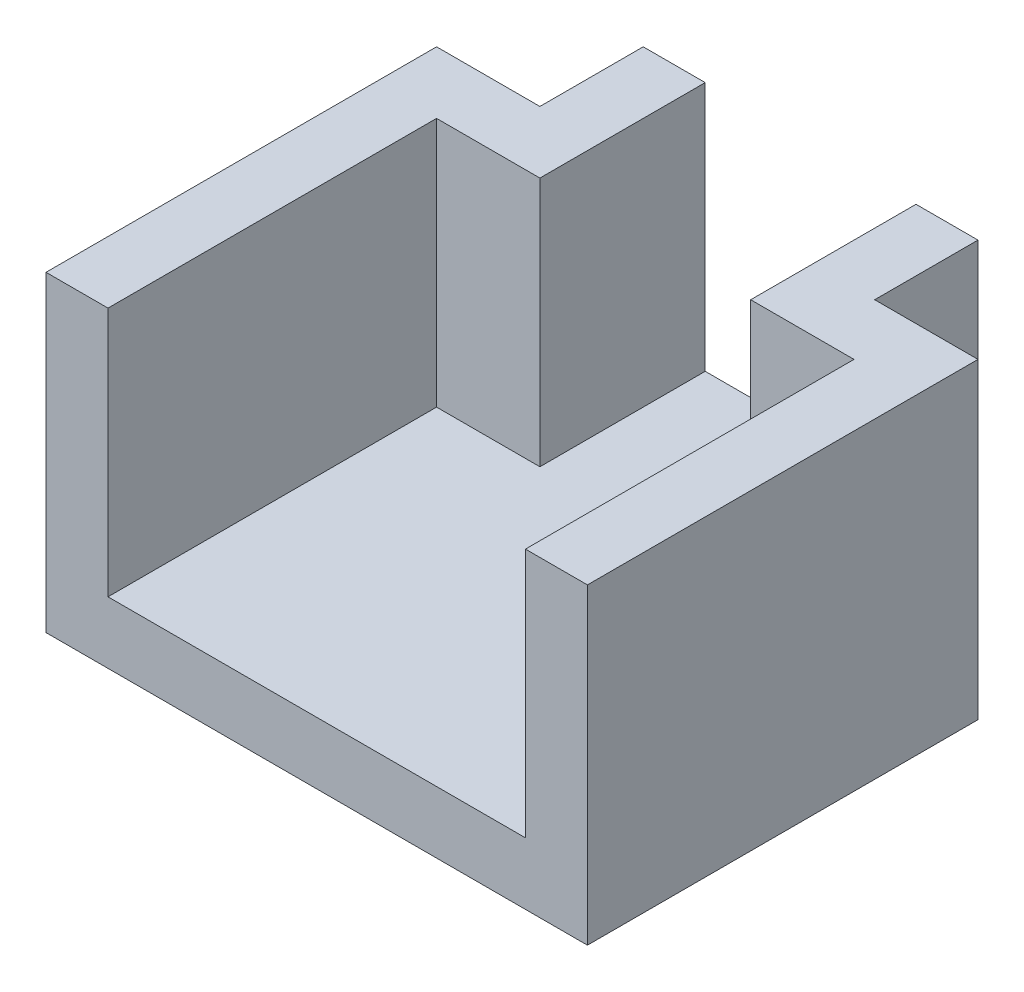
ISO-10303-21;
HEADER;
FILE_DESCRIPTION(('STEP AP214'),'2;1');
FILE_NAME('part.step','',(''),(''),'','','');
FILE_SCHEMA(('AUTOMOTIVE_DESIGN { 1 0 10303 214 1 1 1 1 }'));
ENDSEC;
DATA;
#1=APPLICATION_CONTEXT('core data for automotive mechanical design processes');
#2=APPLICATION_PROTOCOL_DEFINITION('international standard','automotive_design',2000,#1);
#3=PRODUCT_CONTEXT('',#1,'mechanical');
#4=PRODUCT('Part','Part','',(#3));
#5=PRODUCT_RELATED_PRODUCT_CATEGORY('part','',(#4));
#6=PRODUCT_DEFINITION_FORMATION('','',#4);
#7=PRODUCT_DEFINITION_CONTEXT('part definition',#1,'design');
#8=PRODUCT_DEFINITION('design','',#6,#7);
#9=PRODUCT_DEFINITION_SHAPE('','',#8);
#10=(LENGTH_UNIT() NAMED_UNIT(*) SI_UNIT(.MILLI.,.METRE.));
#11=(NAMED_UNIT(*) PLANE_ANGLE_UNIT() SI_UNIT($,.RADIAN.));
#12=(NAMED_UNIT(*) SI_UNIT($,.STERADIAN.) SOLID_ANGLE_UNIT());
#13=UNCERTAINTY_MEASURE_WITH_UNIT(LENGTH_MEASURE(1.E-05),#10,'distance_accuracy_value','');
#14=(GEOMETRIC_REPRESENTATION_CONTEXT(3) GLOBAL_UNCERTAINTY_ASSIGNED_CONTEXT((#13)) GLOBAL_UNIT_ASSIGNED_CONTEXT((#10,
#11,#12)) REPRESENTATION_CONTEXT('',''));
#15=CARTESIAN_POINT('',(0.,0.,0.));
#16=DIRECTION('',(0.,0.,1.));
#17=DIRECTION('',(1.,0.,0.));
#18=AXIS2_PLACEMENT_3D('',#15,#16,#17);
#19=CARTESIAN_POINT('',(0.,3.,0.));
#20=DIRECTION('',(0.,1.,0.));
#21=DIRECTION('',(0.,0.,1.));
#22=AXIS2_PLACEMENT_3D('',#19,#20,#21);
#23=PLANE('',#22);
#24=DIRECTION('',(-1.,0.,0.));
#25=VECTOR('',#24,1.);
#26=CARTESIAN_POINT('',(0.,3.,8.));
#27=LINE('',#26,#25);
#28=CARTESIAN_POINT('',(20.2,3.,8.));
#29=VERTEX_POINT('',#28);
#30=CARTESIAN_POINT('',(15.2,3.,8.));
#31=VERTEX_POINT('',#30);
#32=EDGE_CURVE('E196',#29,#31,#27,.T.);
#33=ORIENTED_EDGE('',*,*,#32,.T.);
#34=DIRECTION('',(0.,0.,-1.));
#35=VECTOR('',#34,1.);
#36=CARTESIAN_POINT('',(15.2,3.,0.));
#37=LINE('',#36,#35);
#38=CARTESIAN_POINT('',(15.2,3.,0.));
#39=VERTEX_POINT('',#38);
#40=EDGE_CURVE('E199',#31,#39,#37,.T.);
#41=ORIENTED_EDGE('',*,*,#40,.T.);
#42=DIRECTION('',(1.,0.,0.));
#43=VECTOR('',#42,1.);
#44=CARTESIAN_POINT('',(0.,3.,0.));
#45=LINE('',#44,#43);
#46=CARTESIAN_POINT('',(5.,3.,0.));
#47=VERTEX_POINT('',#46);
#48=EDGE_CURVE('E244',#47,#39,#45,.T.);
#49=ORIENTED_EDGE('',*,*,#48,.F.);
#50=DIRECTION('',(0.,0.,-1.));
#51=VECTOR('',#50,1.);
#52=CARTESIAN_POINT('',(5.,3.,0.));
#53=LINE('',#52,#51);
#54=CARTESIAN_POINT('',(5.,3.,8.));
#55=VERTEX_POINT('',#54);
#56=EDGE_CURVE('E238',#55,#47,#53,.T.);
#57=ORIENTED_EDGE('',*,*,#56,.F.);
#58=DIRECTION('',(1.,0.,0.));
#59=VECTOR('',#58,1.);
#60=CARTESIAN_POINT('',(0.,3.,8.));
#61=LINE('',#60,#59);
#62=CARTESIAN_POINT('',(0.,3.,8.));
#63=VERTEX_POINT('',#62);
#64=EDGE_CURVE('E240',#63,#55,#61,.T.);
#65=ORIENTED_EDGE('',*,*,#64,.F.);
#66=DIRECTION('',(0.,0.,-1.));
#67=VECTOR('',#66,1.);
#68=CARTESIAN_POINT('',(0.,3.,0.));
#69=LINE('',#68,#67);
#70=CARTESIAN_POINT('',(0.,3.,23.9));
#71=VERTEX_POINT('',#70);
#72=EDGE_CURVE('E242',#71,#63,#69,.T.);
#73=ORIENTED_EDGE('',*,*,#72,.F.);
#74=DIRECTION('',(-1.,0.,0.));
#75=VECTOR('',#74,1.);
#76=CARTESIAN_POINT('',(0.,3.,23.9));
#77=LINE('',#76,#75);
#78=CARTESIAN_POINT('',(20.2,3.,23.9));
#79=VERTEX_POINT('',#78);
#80=EDGE_CURVE('E247',#79,#71,#77,.T.);
#81=ORIENTED_EDGE('',*,*,#80,.F.);
#82=DIRECTION('',(0.,0.,-1.));
#83=VECTOR('',#82,1.);
#84=CARTESIAN_POINT('',(20.2,3.,0.));
#85=LINE('',#84,#83);
#86=EDGE_CURVE('E193',#79,#29,#85,.T.);
#87=ORIENTED_EDGE('',*,*,#86,.T.);
#88=EDGE_LOOP('',(#33,#41,#49,#57,#65,#73,#81,#87));
#89=FACE_BOUND('',#88,.T.);
#90=ADVANCED_FACE('F39',(#89),#23,.T.);
#91=CARTESIAN_POINT('',(0.,3.,5.00000000000001));
#92=DIRECTION('',(0.,0.,-1.));
#93=DIRECTION('',(-1.,0.,0.));
#94=AXIS2_PLACEMENT_3D('',#91,#92,#93);
#95=PLANE('',#94);
#96=DIRECTION('',(1.,0.,0.));
#97=VECTOR('',#96,1.);
#98=CARTESIAN_POINT('',(0.,0.,5.00000000000001));
#99=LINE('',#98,#97);
#100=CARTESIAN_POINT('',(18.2,0.,5.));
#101=VERTEX_POINT('',#100);
#102=CARTESIAN_POINT('',(23.2,0.,5.));
#103=VERTEX_POINT('',#102);
#104=EDGE_CURVE('E154',#101,#103,#99,.T.);
#105=ORIENTED_EDGE('',*,*,#104,.F.);
#106=DIRECTION('',(0.,-1.,0.));
#107=VECTOR('',#106,1.);
#108=CARTESIAN_POINT('',(18.2,3.,5.));
#109=LINE('',#108,#107);
#110=CARTESIAN_POINT('',(18.2,15.1,5.));
#111=VERTEX_POINT('',#110);
#112=EDGE_CURVE('E11',#111,#101,#109,.T.);
#113=ORIENTED_EDGE('',*,*,#112,.F.);
#114=DIRECTION('',(1.,0.,0.));
#115=VECTOR('',#114,1.);
#116=CARTESIAN_POINT('',(0.,15.1,5.00000000000001));
#117=LINE('',#116,#115);
#118=CARTESIAN_POINT('',(23.2,15.1,5.));
#119=VERTEX_POINT('',#118);
#120=EDGE_CURVE('E152',#111,#119,#117,.T.);
#121=ORIENTED_EDGE('',*,*,#120,.T.);
#122=DIRECTION('',(0.,-1.,0.));
#123=VECTOR('',#122,1.);
#124=CARTESIAN_POINT('',(23.2,3.,5.));
#125=LINE('',#124,#123);
#126=EDGE_CURVE('E54',#119,#103,#125,.T.);
#127=ORIENTED_EDGE('',*,*,#126,.T.);
#128=EDGE_LOOP('',(#105,#113,#121,#127));
#129=FACE_BOUND('',#128,.T.);
#130=ADVANCED_FACE('F41',(#129),#95,.T.);
#131=CARTESIAN_POINT('',(18.2,3.,0.));
#132=DIRECTION('',(-1.,0.,0.));
#133=DIRECTION('',(0.,0.,1.));
#134=AXIS2_PLACEMENT_3D('',#131,#132,#133);
#135=PLANE('',#134);
#136=DIRECTION('',(0.,0.,-1.));
#137=VECTOR('',#136,1.);
#138=CARTESIAN_POINT('',(18.2,0.,0.));
#139=LINE('',#138,#137);
#140=CARTESIAN_POINT('',(18.2,0.,0.));
#141=VERTEX_POINT('',#140);
#142=EDGE_CURVE('E251',#101,#141,#139,.T.);
#143=ORIENTED_EDGE('',*,*,#142,.T.);
#144=DIRECTION('',(0.,-1.,0.));
#145=VECTOR('',#144,1.);
#146=CARTESIAN_POINT('',(18.2,3.,0.));
#147=LINE('',#146,#145);
#148=CARTESIAN_POINT('',(18.2,15.1,0.));
#149=VERTEX_POINT('',#148);
#150=EDGE_CURVE('E47',#149,#141,#147,.T.);
#151=ORIENTED_EDGE('',*,*,#150,.F.);
#152=DIRECTION('',(0.,0.,-1.));
#153=VECTOR('',#152,1.);
#154=CARTESIAN_POINT('',(18.2,15.1,0.));
#155=LINE('',#154,#153);
#156=EDGE_CURVE('E159',#111,#149,#155,.T.);
#157=ORIENTED_EDGE('',*,*,#156,.F.);
#158=ORIENTED_EDGE('',*,*,#112,.T.);
#159=EDGE_LOOP('',(#143,#151,#157,#158));
#160=FACE_BOUND('',#159,.T.);
#161=ADVANCED_FACE('F160',(#160),#135,.F.);
#162=CARTESIAN_POINT('',(0.,3.,0.));
#163=DIRECTION('',(0.,0.,-1.));
#164=DIRECTION('',(-1.,0.,0.));
#165=AXIS2_PLACEMENT_3D('',#162,#163,#164);
#166=PLANE('',#165);
#167=ORIENTED_EDGE('',*,*,#150,.T.);
#168=DIRECTION('',(1.,0.,0.));
#169=VECTOR('',#168,1.);
#170=CARTESIAN_POINT('',(0.,0.,0.));
#171=LINE('',#170,#169);
#172=CARTESIAN_POINT('',(2.,0.,0.));
#173=VERTEX_POINT('',#172);
#174=EDGE_CURVE('E253',#173,#141,#171,.T.);
#175=ORIENTED_EDGE('',*,*,#174,.F.);
#176=DIRECTION('',(0.,-1.,0.));
#177=VECTOR('',#176,1.);
#178=CARTESIAN_POINT('',(2.,3.,0.));
#179=LINE('',#178,#177);
#180=CARTESIAN_POINT('',(2.,15.1,0.));
#181=VERTEX_POINT('',#180);
#182=EDGE_CURVE('E277',#181,#173,#179,.T.);
#183=ORIENTED_EDGE('',*,*,#182,.F.);
#184=DIRECTION('',(1.,0.,0.));
#185=VECTOR('',#184,1.);
#186=CARTESIAN_POINT('',(0.,15.1,0.));
#187=LINE('',#186,#185);
#188=CARTESIAN_POINT('',(5.,15.1,0.));
#189=VERTEX_POINT('',#188);
#190=EDGE_CURVE('E211',#181,#189,#187,.T.);
#191=ORIENTED_EDGE('',*,*,#190,.T.);
#192=DIRECTION('',(0.,-1.,0.));
#193=VECTOR('',#192,1.);
#194=CARTESIAN_POINT('',(5.,15.1,0.));
#195=LINE('',#194,#193);
#196=EDGE_CURVE('E229',#189,#47,#195,.T.);
#197=ORIENTED_EDGE('',*,*,#196,.T.);
#198=ORIENTED_EDGE('',*,*,#48,.T.);
#199=DIRECTION('',(0.,-1.,0.));
#200=VECTOR('',#199,1.);
#201=CARTESIAN_POINT('',(15.2,15.1,0.));
#202=LINE('',#201,#200);
#203=CARTESIAN_POINT('',(15.2,15.1,0.));
#204=VERTEX_POINT('',#203);
#205=EDGE_CURVE('E191',#204,#39,#202,.T.);
#206=ORIENTED_EDGE('',*,*,#205,.F.);
#207=DIRECTION('',(1.,0.,0.));
#208=VECTOR('',#207,1.);
#209=CARTESIAN_POINT('',(0.,15.1,0.));
#210=LINE('',#209,#208);
#211=EDGE_CURVE('E165',#204,#149,#210,.T.);
#212=ORIENTED_EDGE('',*,*,#211,.T.);
#213=EDGE_LOOP('',(#167,#175,#183,#191,#197,#198,#206,#212));
#214=FACE_BOUND('',#213,.T.);
#215=ADVANCED_FACE('F280',(#214),#166,.T.);
#216=CARTESIAN_POINT('',(2.,3.,0.));
#217=DIRECTION('',(-1.,0.,0.));
#218=DIRECTION('',(0.,0.,1.));
#219=AXIS2_PLACEMENT_3D('',#216,#217,#218);
#220=PLANE('',#219);
#221=DIRECTION('',(0.,0.,-1.));
#222=VECTOR('',#221,1.);
#223=CARTESIAN_POINT('',(2.,0.,0.));
#224=LINE('',#223,#222);
#225=CARTESIAN_POINT('',(2.,0.,5.));
#226=VERTEX_POINT('',#225);
#227=EDGE_CURVE('E255',#226,#173,#224,.T.);
#228=ORIENTED_EDGE('',*,*,#227,.F.);
#229=DIRECTION('',(0.,-1.,0.));
#230=VECTOR('',#229,1.);
#231=CARTESIAN_POINT('',(2.,3.,5.));
#232=LINE('',#231,#230);
#233=CARTESIAN_POINT('',(2.,15.1,5.));
#234=VERTEX_POINT('',#233);
#235=EDGE_CURVE('E275',#234,#226,#232,.T.);
#236=ORIENTED_EDGE('',*,*,#235,.F.);
#237=DIRECTION('',(0.,0.,-1.));
#238=VECTOR('',#237,1.);
#239=CARTESIAN_POINT('',(2.,15.1,0.));
#240=LINE('',#239,#238);
#241=EDGE_CURVE('E214',#234,#181,#240,.T.);
#242=ORIENTED_EDGE('',*,*,#241,.T.);
#243=ORIENTED_EDGE('',*,*,#182,.T.);
#244=EDGE_LOOP('',(#228,#236,#242,#243));
#245=FACE_BOUND('',#244,.T.);
#246=ADVANCED_FACE('F287',(#245),#220,.T.);
#247=CARTESIAN_POINT('',(0.,3.,5.));
#248=DIRECTION('',(0.,0.,1.));
#249=DIRECTION('',(1.,0.,0.));
#250=AXIS2_PLACEMENT_3D('',#247,#248,#249);
#251=PLANE('',#250);
#252=DIRECTION('',(-1.,0.,0.));
#253=VECTOR('',#252,1.);
#254=CARTESIAN_POINT('',(0.,0.,5.));
#255=LINE('',#254,#253);
#256=CARTESIAN_POINT('',(-3.,0.,5.));
#257=VERTEX_POINT('',#256);
#258=EDGE_CURVE('E258',#226,#257,#255,.T.);
#259=ORIENTED_EDGE('',*,*,#258,.T.);
#260=DIRECTION('',(0.,-1.,0.));
#261=VECTOR('',#260,1.);
#262=CARTESIAN_POINT('',(-3.,3.,5.));
#263=LINE('',#262,#261);
#264=CARTESIAN_POINT('',(-3.,15.1,5.));
#265=VERTEX_POINT('',#264);
#266=EDGE_CURVE('E272',#265,#257,#263,.T.);
#267=ORIENTED_EDGE('',*,*,#266,.F.);
#268=DIRECTION('',(-1.,0.,0.));
#269=VECTOR('',#268,1.);
#270=CARTESIAN_POINT('',(0.,15.1,5.));
#271=LINE('',#270,#269);
#272=EDGE_CURVE('E217',#234,#265,#271,.T.);
#273=ORIENTED_EDGE('',*,*,#272,.F.);
#274=ORIENTED_EDGE('',*,*,#235,.T.);
#275=EDGE_LOOP('',(#259,#267,#273,#274));
#276=FACE_BOUND('',#275,.T.);
#277=ADVANCED_FACE('F411',(#276),#251,.F.);
#278=CARTESIAN_POINT('',(-3.,3.,0.));
#279=DIRECTION('',(1.,0.,0.));
#280=DIRECTION('',(0.,0.,-1.));
#281=AXIS2_PLACEMENT_3D('',#278,#279,#280);
#282=PLANE('',#281);
#283=DIRECTION('',(0.,0.,1.));
#284=VECTOR('',#283,1.);
#285=CARTESIAN_POINT('',(-3.,0.,0.));
#286=LINE('',#285,#284);
#287=CARTESIAN_POINT('',(-3.,0.,23.9));
#288=VERTEX_POINT('',#287);
#289=EDGE_CURVE('E260',#257,#288,#286,.T.);
#290=ORIENTED_EDGE('',*,*,#289,.T.);
#291=DIRECTION('',(0.,-1.,0.));
#292=VECTOR('',#291,1.);
#293=CARTESIAN_POINT('',(-3.,3.,23.9));
#294=LINE('',#293,#292);
#295=CARTESIAN_POINT('',(-3.,15.1,23.9));
#296=VERTEX_POINT('',#295);
#297=EDGE_CURVE('E269',#296,#288,#294,.T.);
#298=ORIENTED_EDGE('',*,*,#297,.F.);
#299=DIRECTION('',(0.,0.,1.));
#300=VECTOR('',#299,1.);
#301=CARTESIAN_POINT('',(-3.,15.1,0.));
#302=LINE('',#301,#300);
#303=EDGE_CURVE('E220',#265,#296,#302,.T.);
#304=ORIENTED_EDGE('',*,*,#303,.F.);
#305=ORIENTED_EDGE('',*,*,#266,.T.);
#306=EDGE_LOOP('',(#290,#298,#304,#305));
#307=FACE_BOUND('',#306,.T.);
#308=ADVANCED_FACE('F327',(#307),#282,.F.);
#309=CARTESIAN_POINT('',(0.,3.,23.9));
#310=DIRECTION('',(0.,0.,1.));
#311=DIRECTION('',(1.,0.,0.));
#312=AXIS2_PLACEMENT_3D('',#309,#310,#311);
#313=PLANE('',#312);
#314=DIRECTION('',(0.,-1.,0.));
#315=VECTOR('',#314,1.);
#316=CARTESIAN_POINT('',(20.2,15.1,23.9));
#317=LINE('',#316,#315);
#318=CARTESIAN_POINT('',(20.2,15.1,23.9));
#319=VERTEX_POINT('',#318);
#320=EDGE_CURVE('E182',#319,#79,#317,.T.);
#321=ORIENTED_EDGE('',*,*,#320,.T.);
#322=ORIENTED_EDGE('',*,*,#80,.T.);
#323=DIRECTION('',(0.,-1.,0.));
#324=VECTOR('',#323,1.);
#325=CARTESIAN_POINT('',(0.,15.1,23.9));
#326=LINE('',#325,#324);
#327=CARTESIAN_POINT('',(0.,15.1,23.9));
#328=VERTEX_POINT('',#327);
#329=EDGE_CURVE('E226',#328,#71,#326,.T.);
#330=ORIENTED_EDGE('',*,*,#329,.F.);
#331=DIRECTION('',(-1.,0.,0.));
#332=VECTOR('',#331,1.);
#333=CARTESIAN_POINT('',(0.,15.1,23.9));
#334=LINE('',#333,#332);
#335=EDGE_CURVE('E223',#328,#296,#334,.T.);
#336=ORIENTED_EDGE('',*,*,#335,.T.);
#337=ORIENTED_EDGE('',*,*,#297,.T.);
#338=DIRECTION('',(-1.,0.,0.));
#339=VECTOR('',#338,1.);
#340=CARTESIAN_POINT('',(0.,0.,23.9));
#341=LINE('',#340,#339);
#342=CARTESIAN_POINT('',(23.2,0.,23.9));
#343=VERTEX_POINT('',#342);
#344=EDGE_CURVE('E263',#343,#288,#341,.T.);
#345=ORIENTED_EDGE('',*,*,#344,.F.);
#346=DIRECTION('',(0.,-1.,0.));
#347=VECTOR('',#346,1.);
#348=CARTESIAN_POINT('',(23.2,3.,23.9));
#349=LINE('',#348,#347);
#350=CARTESIAN_POINT('',(23.2,15.1,23.9));
#351=VERTEX_POINT('',#350);
#352=EDGE_CURVE('E62',#351,#343,#349,.T.);
#353=ORIENTED_EDGE('',*,*,#352,.F.);
#354=DIRECTION('',(1.,0.,0.));
#355=VECTOR('',#354,1.);
#356=CARTESIAN_POINT('',(0.,15.1,23.9));
#357=LINE('',#356,#355);
#358=EDGE_CURVE('E179',#319,#351,#357,.T.);
#359=ORIENTED_EDGE('',*,*,#358,.F.);
#360=EDGE_LOOP('',(#321,#322,#330,#336,#337,#345,#353,#359));
#361=FACE_BOUND('',#360,.T.);
#362=ADVANCED_FACE('F317',(#361),#313,.T.);
#363=CARTESIAN_POINT('',(23.2,3.,0.));
#364=DIRECTION('',(1.,0.,0.));
#365=DIRECTION('',(0.,0.,-1.));
#366=AXIS2_PLACEMENT_3D('',#363,#364,#365);
#367=PLANE('',#366);
#368=DIRECTION('',(0.,0.,1.));
#369=VECTOR('',#368,1.);
#370=CARTESIAN_POINT('',(23.2,0.,0.));
#371=LINE('',#370,#369);
#372=EDGE_CURVE('E248',#103,#343,#371,.T.);
#373=ORIENTED_EDGE('',*,*,#372,.F.);
#374=ORIENTED_EDGE('',*,*,#126,.F.);
#375=DIRECTION('',(0.,0.,1.));
#376=VECTOR('',#375,1.);
#377=CARTESIAN_POINT('',(23.2,15.1,0.));
#378=LINE('',#377,#376);
#379=EDGE_CURVE('E169',#119,#351,#378,.T.);
#380=ORIENTED_EDGE('',*,*,#379,.T.);
#381=ORIENTED_EDGE('',*,*,#352,.T.);
#382=EDGE_LOOP('',(#373,#374,#380,#381));
#383=FACE_BOUND('',#382,.T.);
#384=ADVANCED_FACE('F318',(#383),#367,.T.);
#385=CARTESIAN_POINT('',(0.,0.,0.));
#386=DIRECTION('',(0.,1.,0.));
#387=DIRECTION('',(0.,0.,1.));
#388=AXIS2_PLACEMENT_3D('',#385,#386,#387);
#389=PLANE('',#388);
#390=ORIENTED_EDGE('',*,*,#174,.T.);
#391=ORIENTED_EDGE('',*,*,#142,.F.);
#392=ORIENTED_EDGE('',*,*,#104,.T.);
#393=ORIENTED_EDGE('',*,*,#372,.T.);
#394=ORIENTED_EDGE('',*,*,#344,.T.);
#395=ORIENTED_EDGE('',*,*,#289,.F.);
#396=ORIENTED_EDGE('',*,*,#258,.F.);
#397=ORIENTED_EDGE('',*,*,#227,.T.);
#398=EDGE_LOOP('',(#390,#391,#392,#393,#394,#395,#396,#397));
#399=FACE_BOUND('',#398,.T.);
#400=ADVANCED_FACE('F282',(#399),#389,.F.);
#401=CARTESIAN_POINT('',(0.,15.1,0.));
#402=DIRECTION('',(1.,0.,0.));
#403=DIRECTION('',(0.,0.,-1.));
#404=AXIS2_PLACEMENT_3D('',#401,#402,#403);
#405=PLANE('',#404);
#406=ORIENTED_EDGE('',*,*,#329,.T.);
#407=ORIENTED_EDGE('',*,*,#72,.T.);
#408=DIRECTION('',(0.,-1.,0.));
#409=VECTOR('',#408,1.);
#410=CARTESIAN_POINT('',(0.,15.1,8.));
#411=LINE('',#410,#409);
#412=CARTESIAN_POINT('',(0.,15.1,8.));
#413=VERTEX_POINT('',#412);
#414=EDGE_CURVE('E235',#413,#63,#411,.T.);
#415=ORIENTED_EDGE('',*,*,#414,.F.);
#416=DIRECTION('',(0.,0.,1.));
#417=VECTOR('',#416,1.);
#418=CARTESIAN_POINT('',(0.,15.1,0.));
#419=LINE('',#418,#417);
#420=EDGE_CURVE('E202',#413,#328,#419,.T.);
#421=ORIENTED_EDGE('',*,*,#420,.T.);
#422=EDGE_LOOP('',(#406,#407,#415,#421));
#423=FACE_BOUND('',#422,.T.);
#424=ADVANCED_FACE('F325',(#423),#405,.T.);
#425=CARTESIAN_POINT('',(0.,15.1,8.));
#426=DIRECTION('',(0.,0.,1.));
#427=DIRECTION('',(1.,0.,0.));
#428=AXIS2_PLACEMENT_3D('',#425,#426,#427);
#429=PLANE('',#428);
#430=ORIENTED_EDGE('',*,*,#414,.T.);
#431=ORIENTED_EDGE('',*,*,#64,.T.);
#432=DIRECTION('',(0.,-1.,0.));
#433=VECTOR('',#432,1.);
#434=CARTESIAN_POINT('',(5.,15.1,8.));
#435=LINE('',#434,#433);
#436=CARTESIAN_POINT('',(5.,15.1,8.));
#437=VERTEX_POINT('',#436);
#438=EDGE_CURVE('E232',#437,#55,#435,.T.);
#439=ORIENTED_EDGE('',*,*,#438,.F.);
#440=DIRECTION('',(-1.,0.,0.));
#441=VECTOR('',#440,1.);
#442=CARTESIAN_POINT('',(0.,15.1,8.));
#443=LINE('',#442,#441);
#444=EDGE_CURVE('E205',#437,#413,#443,.T.);
#445=ORIENTED_EDGE('',*,*,#444,.T.);
#446=EDGE_LOOP('',(#430,#431,#439,#445));
#447=FACE_BOUND('',#446,.T.);
#448=ADVANCED_FACE('F337',(#447),#429,.T.);
#449=CARTESIAN_POINT('',(5.,15.1,0.));
#450=DIRECTION('',(1.,0.,0.));
#451=DIRECTION('',(0.,0.,-1.));
#452=AXIS2_PLACEMENT_3D('',#449,#450,#451);
#453=PLANE('',#452);
#454=ORIENTED_EDGE('',*,*,#438,.T.);
#455=ORIENTED_EDGE('',*,*,#56,.T.);
#456=ORIENTED_EDGE('',*,*,#196,.F.);
#457=DIRECTION('',(0.,0.,1.));
#458=VECTOR('',#457,1.);
#459=CARTESIAN_POINT('',(5.,15.1,0.));
#460=LINE('',#459,#458);
#461=EDGE_CURVE('E208',#189,#437,#460,.T.);
#462=ORIENTED_EDGE('',*,*,#461,.T.);
#463=EDGE_LOOP('',(#454,#455,#456,#462));
#464=FACE_BOUND('',#463,.T.);
#465=ADVANCED_FACE('F297',(#464),#453,.T.);
#466=CARTESIAN_POINT('',(0.,15.1,0.));
#467=DIRECTION('',(0.,1.,0.));
#468=DIRECTION('',(0.,0.,1.));
#469=AXIS2_PLACEMENT_3D('',#466,#467,#468);
#470=PLANE('',#469);
#471=ORIENTED_EDGE('',*,*,#420,.F.);
#472=ORIENTED_EDGE('',*,*,#444,.F.);
#473=ORIENTED_EDGE('',*,*,#461,.F.);
#474=ORIENTED_EDGE('',*,*,#190,.F.);
#475=ORIENTED_EDGE('',*,*,#241,.F.);
#476=ORIENTED_EDGE('',*,*,#272,.T.);
#477=ORIENTED_EDGE('',*,*,#303,.T.);
#478=ORIENTED_EDGE('',*,*,#335,.F.);
#479=EDGE_LOOP('',(#471,#472,#473,#474,#475,#476,#477,#478));
#480=FACE_BOUND('',#479,.T.);
#481=ADVANCED_FACE('F294',(#480),#470,.T.);
#482=CARTESIAN_POINT('',(15.2,15.1,0.));
#483=DIRECTION('',(1.,0.,0.));
#484=DIRECTION('',(0.,0.,-1.));
#485=AXIS2_PLACEMENT_3D('',#482,#483,#484);
#486=PLANE('',#485);
#487=ORIENTED_EDGE('',*,*,#40,.F.);
#488=DIRECTION('',(0.,-1.,0.));
#489=VECTOR('',#488,1.);
#490=CARTESIAN_POINT('',(15.2,15.1,8.));
#491=LINE('',#490,#489);
#492=CARTESIAN_POINT('',(15.2,15.1,8.));
#493=VERTEX_POINT('',#492);
#494=EDGE_CURVE('E188',#493,#31,#491,.T.);
#495=ORIENTED_EDGE('',*,*,#494,.F.);
#496=DIRECTION('',(0.,0.,1.));
#497=VECTOR('',#496,1.);
#498=CARTESIAN_POINT('',(15.2,15.1,0.));
#499=LINE('',#498,#497);
#500=EDGE_CURVE('E173',#204,#493,#499,.T.);
#501=ORIENTED_EDGE('',*,*,#500,.F.);
#502=ORIENTED_EDGE('',*,*,#205,.T.);
#503=EDGE_LOOP('',(#487,#495,#501,#502));
#504=FACE_BOUND('',#503,.T.);
#505=ADVANCED_FACE('F304',(#504),#486,.F.);
#506=CARTESIAN_POINT('',(0.,15.1,8.));
#507=DIRECTION('',(0.,0.,-1.));
#508=DIRECTION('',(-1.,0.,0.));
#509=AXIS2_PLACEMENT_3D('',#506,#507,#508);
#510=PLANE('',#509);
#511=ORIENTED_EDGE('',*,*,#32,.F.);
#512=DIRECTION('',(0.,-1.,0.));
#513=VECTOR('',#512,1.);
#514=CARTESIAN_POINT('',(20.2,15.1,8.));
#515=LINE('',#514,#513);
#516=CARTESIAN_POINT('',(20.2,15.1,8.));
#517=VERTEX_POINT('',#516);
#518=EDGE_CURVE('E185',#517,#29,#515,.T.);
#519=ORIENTED_EDGE('',*,*,#518,.F.);
#520=DIRECTION('',(1.,0.,0.));
#521=VECTOR('',#520,1.);
#522=CARTESIAN_POINT('',(0.,15.1,8.));
#523=LINE('',#522,#521);
#524=EDGE_CURVE('E175',#493,#517,#523,.T.);
#525=ORIENTED_EDGE('',*,*,#524,.F.);
#526=ORIENTED_EDGE('',*,*,#494,.T.);
#527=EDGE_LOOP('',(#511,#519,#525,#526));
#528=FACE_BOUND('',#527,.T.);
#529=ADVANCED_FACE('F308',(#528),#510,.F.);
#530=CARTESIAN_POINT('',(20.2,15.1,0.));
#531=DIRECTION('',(1.,0.,0.));
#532=DIRECTION('',(0.,0.,-1.));
#533=AXIS2_PLACEMENT_3D('',#530,#531,#532);
#534=PLANE('',#533);
#535=ORIENTED_EDGE('',*,*,#86,.F.);
#536=ORIENTED_EDGE('',*,*,#320,.F.);
#537=DIRECTION('',(0.,0.,1.));
#538=VECTOR('',#537,1.);
#539=CARTESIAN_POINT('',(20.2,15.1,0.));
#540=LINE('',#539,#538);
#541=EDGE_CURVE('E177',#517,#319,#540,.T.);
#542=ORIENTED_EDGE('',*,*,#541,.F.);
#543=ORIENTED_EDGE('',*,*,#518,.T.);
#544=EDGE_LOOP('',(#535,#536,#542,#543));
#545=FACE_BOUND('',#544,.T.);
#546=ADVANCED_FACE('F314',(#545),#534,.F.);
#547=CARTESIAN_POINT('',(0.,15.1,0.));
#548=DIRECTION('',(0.,1.,0.));
#549=DIRECTION('',(0.,0.,1.));
#550=AXIS2_PLACEMENT_3D('',#547,#548,#549);
#551=PLANE('',#550);
#552=ORIENTED_EDGE('',*,*,#120,.F.);
#553=ORIENTED_EDGE('',*,*,#156,.T.);
#554=ORIENTED_EDGE('',*,*,#211,.F.);
#555=ORIENTED_EDGE('',*,*,#500,.T.);
#556=ORIENTED_EDGE('',*,*,#524,.T.);
#557=ORIENTED_EDGE('',*,*,#541,.T.);
#558=ORIENTED_EDGE('',*,*,#358,.T.);
#559=ORIENTED_EDGE('',*,*,#379,.F.);
#560=EDGE_LOOP('',(#552,#553,#554,#555,#556,#557,#558,#559));
#561=FACE_BOUND('',#560,.T.);
#562=ADVANCED_FACE('F167',(#561),#551,.T.);
#563=CLOSED_SHELL('',(#90,#130,#161,#215,#246,#277,#308,#362,#384,#400,#424,#448,#465,#481,#505,
#529,#546,#562));
#564=MANIFOLD_SOLID_BREP('B2',#563);
#565=ADVANCED_BREP_SHAPE_REPRESENTATION('',(#18,#564),#14);
#566=SHAPE_DEFINITION_REPRESENTATION(#9,#565);
ENDSEC;
END-ISO-10303-21;
